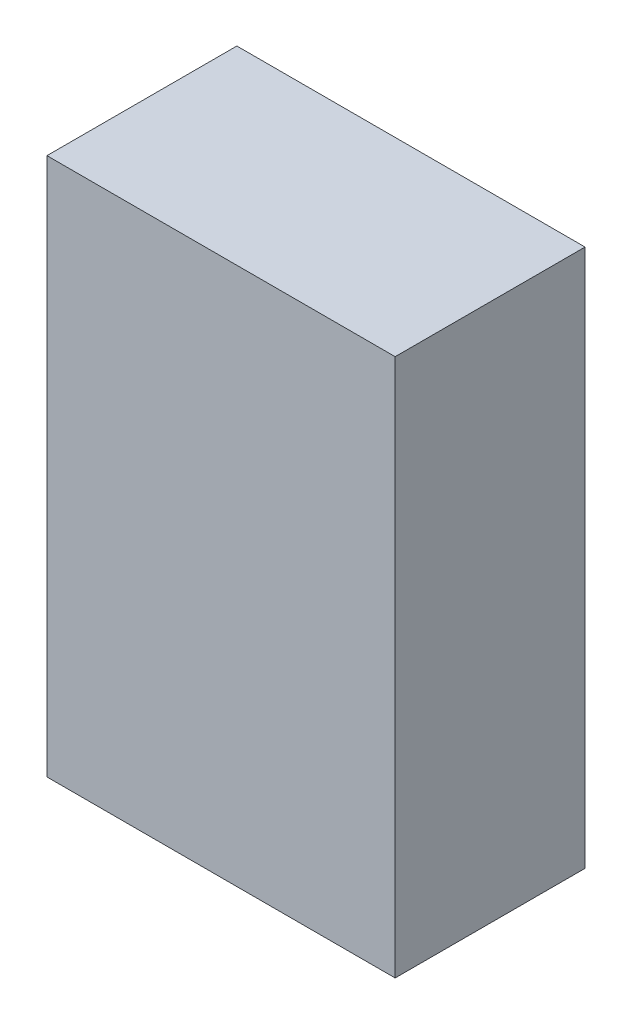
ISO-10303-21;
HEADER;
FILE_DESCRIPTION(('STEP AP214'),'2;1');
FILE_NAME('part.step','',(''),(''),'','','');
FILE_SCHEMA(('AUTOMOTIVE_DESIGN { 1 0 10303 214 1 1 1 1 }'));
ENDSEC;
DATA;
#1=APPLICATION_CONTEXT('core data for automotive mechanical design processes');
#2=APPLICATION_PROTOCOL_DEFINITION('international standard','automotive_design',2000,#1);
#3=PRODUCT_CONTEXT('',#1,'mechanical');
#4=PRODUCT('Part','Part','',(#3));
#5=PRODUCT_RELATED_PRODUCT_CATEGORY('part','',(#4));
#6=PRODUCT_DEFINITION_FORMATION('','',#4);
#7=PRODUCT_DEFINITION_CONTEXT('part definition',#1,'design');
#8=PRODUCT_DEFINITION('design','',#6,#7);
#9=PRODUCT_DEFINITION_SHAPE('','',#8);
#10=(LENGTH_UNIT() NAMED_UNIT(*) SI_UNIT(.MILLI.,.METRE.));
#11=(NAMED_UNIT(*) PLANE_ANGLE_UNIT() SI_UNIT($,.RADIAN.));
#12=(NAMED_UNIT(*) SI_UNIT($,.STERADIAN.) SOLID_ANGLE_UNIT());
#13=UNCERTAINTY_MEASURE_WITH_UNIT(LENGTH_MEASURE(1.E-05),#10,'distance_accuracy_value','');
#14=(GEOMETRIC_REPRESENTATION_CONTEXT(3) GLOBAL_UNCERTAINTY_ASSIGNED_CONTEXT((#13)) GLOBAL_UNIT_ASSIGNED_CONTEXT((#10,
#11,#12)) REPRESENTATION_CONTEXT('',''));
#15=CARTESIAN_POINT('',(0.,0.,0.));
#16=DIRECTION('',(0.,0.,1.));
#17=DIRECTION('',(1.,0.,0.));
#18=AXIS2_PLACEMENT_3D('',#15,#16,#17);
#19=CARTESIAN_POINT('',(0.,0.,1.199896));
#20=DIRECTION('',(0.,0.,1.));
#21=DIRECTION('',(1.,0.,0.));
#22=AXIS2_PLACEMENT_3D('',#19,#20,#21);
#23=PLANE('',#22);
#24=DIRECTION('',(1.,0.,0.));
#25=VECTOR('',#24,1.);
#26=CARTESIAN_POINT('',(-1.100074,1.700022,1.19989600022));
#27=LINE('',#26,#25);
#28=CARTESIAN_POINT('',(-1.100074,1.700022,1.19989600022));
#29=VERTEX_POINT('',#28);
#30=CARTESIAN_POINT('',(1.100074,1.700022,1.19989600022));
#31=VERTEX_POINT('',#30);
#32=EDGE_CURVE('E11',#29,#31,#27,.T.);
#33=ORIENTED_EDGE('',*,*,#32,.F.);
#34=DIRECTION('',(0.,1.,0.));
#35=VECTOR('',#34,1.);
#36=CARTESIAN_POINT('',(-1.100074,-1.700021999927,1.19989600022));
#37=LINE('',#36,#35);
#38=CARTESIAN_POINT('',(-1.100074,-1.700021999927,1.19989600022));
#39=VERTEX_POINT('',#38);
#40=EDGE_CURVE('E22',#39,#29,#37,.T.);
#41=ORIENTED_EDGE('',*,*,#40,.F.);
#42=DIRECTION('',(-1.,3.333109381776E-11,0.));
#43=VECTOR('',#42,1.);
#44=CARTESIAN_POINT('',(1.100074,-1.700022,1.19989600022));
#45=LINE('',#44,#43);
#46=CARTESIAN_POINT('',(1.100074,-1.700022,1.19989600022));
#47=VERTEX_POINT('',#46);
#48=EDGE_CURVE('E81',#47,#39,#45,.T.);
#49=ORIENTED_EDGE('',*,*,#48,.F.);
#50=DIRECTION('',(0.,-1.,0.));
#51=VECTOR('',#50,1.);
#52=CARTESIAN_POINT('',(1.100074,1.700022,1.19989600022));
#53=LINE('',#52,#51);
#54=EDGE_CURVE('E50',#31,#47,#53,.T.);
#55=ORIENTED_EDGE('',*,*,#54,.F.);
#56=EDGE_LOOP('',(#33,#41,#49,#55));
#57=FACE_BOUND('',#56,.T.);
#58=ADVANCED_FACE('F18',(#57),#23,.T.);
#59=CARTESIAN_POINT('',(1.100074,1.700022,0.));
#60=DIRECTION('',(0.,1.,0.));
#61=DIRECTION('',(1.,0.,0.));
#62=AXIS2_PLACEMENT_3D('',#59,#60,#61);
#63=PLANE('',#62);
#64=ORIENTED_EDGE('',*,*,#32,.T.);
#65=DIRECTION('',(1.833492387361E-10,2.277975390358E-10,-1.));
#66=VECTOR('',#65,1.);
#67=CARTESIAN_POINT('',(1.100074,1.700022,1.19989600022));
#68=LINE('',#67,#66);
#69=CARTESIAN_POINT('',(1.10007400022,1.700022000273,0.));
#70=VERTEX_POINT('',#69);
#71=EDGE_CURVE('E28',#31,#70,#68,.T.);
#72=ORIENTED_EDGE('',*,*,#71,.T.);
#73=DIRECTION('',(1.,0.,0.));
#74=VECTOR('',#73,1.);
#75=CARTESIAN_POINT('',(-1.10007400022,1.700022000273,0.));
#76=LINE('',#75,#74);
#77=CARTESIAN_POINT('',(-1.10007400022,1.700022000273,0.));
#78=VERTEX_POINT('',#77);
#79=EDGE_CURVE('E108',#78,#70,#76,.T.);
#80=ORIENTED_EDGE('',*,*,#79,.F.);
#81=DIRECTION('',(-1.833492387361E-10,2.277975390358E-10,-1.));
#82=VECTOR('',#81,1.);
#83=CARTESIAN_POINT('',(-1.100074,1.700022,1.19989600022));
#84=LINE('',#83,#82);
#85=EDGE_CURVE('E73',#29,#78,#84,.T.);
#86=ORIENTED_EDGE('',*,*,#85,.F.);
#87=EDGE_LOOP('',(#64,#72,#80,#86));
#88=FACE_BOUND('',#87,.T.);
#89=ADVANCED_FACE('F149',(#88),#63,.T.);
#90=CARTESIAN_POINT('',(1.100074,-1.700022,0.));
#91=DIRECTION('',(1.,0.,0.));
#92=DIRECTION('',(0.,1.,0.));
#93=AXIS2_PLACEMENT_3D('',#90,#91,#92);
#94=PLANE('',#93);
#95=ORIENTED_EDGE('',*,*,#54,.T.);
#96=DIRECTION('',(1.833492387361E-10,-2.277975390358E-10,-1.));
#97=VECTOR('',#96,1.);
#98=CARTESIAN_POINT('',(1.100074,-1.700022,1.19989600022));
#99=LINE('',#98,#97);
#100=CARTESIAN_POINT('',(1.10007400022,-1.700022000273,0.));
#101=VERTEX_POINT('',#100);
#102=EDGE_CURVE('E112',#47,#101,#99,.T.);
#103=ORIENTED_EDGE('',*,*,#102,.T.);
#104=DIRECTION('',(0.,-1.,0.));
#105=VECTOR('',#104,1.);
#106=CARTESIAN_POINT('',(1.10007400022,1.700022000273,0.));
#107=LINE('',#106,#105);
#108=EDGE_CURVE('E99',#70,#101,#107,.T.);
#109=ORIENTED_EDGE('',*,*,#108,.F.);
#110=ORIENTED_EDGE('',*,*,#71,.F.);
#111=EDGE_LOOP('',(#95,#103,#109,#110));
#112=FACE_BOUND('',#111,.T.);
#113=ADVANCED_FACE('F143',(#112),#94,.T.);
#114=CARTESIAN_POINT('',(-1.100074,-1.700022,0.));
#115=DIRECTION('',(0.,-1.,0.));
#116=DIRECTION('',(0.,0.,-1.));
#117=AXIS2_PLACEMENT_3D('',#114,#115,#116);
#118=PLANE('',#117);
#119=ORIENTED_EDGE('',*,*,#48,.T.);
#120=DIRECTION('',(-1.833492387361E-10,-2.277975390358E-10,-1.));
#121=VECTOR('',#120,1.);
#122=CARTESIAN_POINT('',(-1.100074,-1.700021999927,1.19989600022));
#123=LINE('',#122,#121);
#124=CARTESIAN_POINT('',(-1.10007400022,-1.7000220002,0.));
#125=VERTEX_POINT('',#124);
#126=EDGE_CURVE('E85',#39,#125,#123,.T.);
#127=ORIENTED_EDGE('',*,*,#126,.T.);
#128=DIRECTION('',(-1.,3.33310938111E-11,0.));
#129=VECTOR('',#128,1.);
#130=CARTESIAN_POINT('',(1.10007400022,-1.700022000273,0.));
#131=LINE('',#130,#129);
#132=EDGE_CURVE('E88',#101,#125,#131,.T.);
#133=ORIENTED_EDGE('',*,*,#132,.F.);
#134=ORIENTED_EDGE('',*,*,#102,.F.);
#135=EDGE_LOOP('',(#119,#127,#133,#134));
#136=FACE_BOUND('',#135,.T.);
#137=ADVANCED_FACE('F86',(#136),#118,.T.);
#138=CARTESIAN_POINT('',(-1.100074,1.700022,0.));
#139=DIRECTION('',(-1.,0.,0.));
#140=DIRECTION('',(0.,0.,1.));
#141=AXIS2_PLACEMENT_3D('',#138,#139,#140);
#142=PLANE('',#141);
#143=ORIENTED_EDGE('',*,*,#40,.T.);
#144=ORIENTED_EDGE('',*,*,#85,.T.);
#145=DIRECTION('',(0.,1.,0.));
#146=VECTOR('',#145,1.);
#147=CARTESIAN_POINT('',(-1.10007400022,-1.7000220002,0.));
#148=LINE('',#147,#146);
#149=EDGE_CURVE('E93',#125,#78,#148,.T.);
#150=ORIENTED_EDGE('',*,*,#149,.F.);
#151=ORIENTED_EDGE('',*,*,#126,.F.);
#152=EDGE_LOOP('',(#143,#144,#150,#151));
#153=FACE_BOUND('',#152,.T.);
#154=ADVANCED_FACE('F20',(#153),#142,.T.);
#155=CARTESIAN_POINT('',(0.,0.,0.));
#156=DIRECTION('',(0.,0.,1.));
#157=DIRECTION('',(1.,0.,0.));
#158=AXIS2_PLACEMENT_3D('',#155,#156,#157);
#159=PLANE('',#158);
#160=ORIENTED_EDGE('',*,*,#79,.T.);
#161=ORIENTED_EDGE('',*,*,#108,.T.);
#162=ORIENTED_EDGE('',*,*,#132,.T.);
#163=ORIENTED_EDGE('',*,*,#149,.T.);
#164=EDGE_LOOP('',(#160,#161,#162,#163));
#165=FACE_BOUND('',#164,.T.);
#166=ADVANCED_FACE('F98',(#165),#159,.F.);
#167=CLOSED_SHELL('',(#58,#89,#113,#137,#154,#166));
#168=MANIFOLD_SOLID_BREP('B1',#167);
#169=ADVANCED_BREP_SHAPE_REPRESENTATION('',(#18,#168),#14);
#170=SHAPE_DEFINITION_REPRESENTATION(#9,#169);
ENDSEC;
END-ISO-10303-21;
